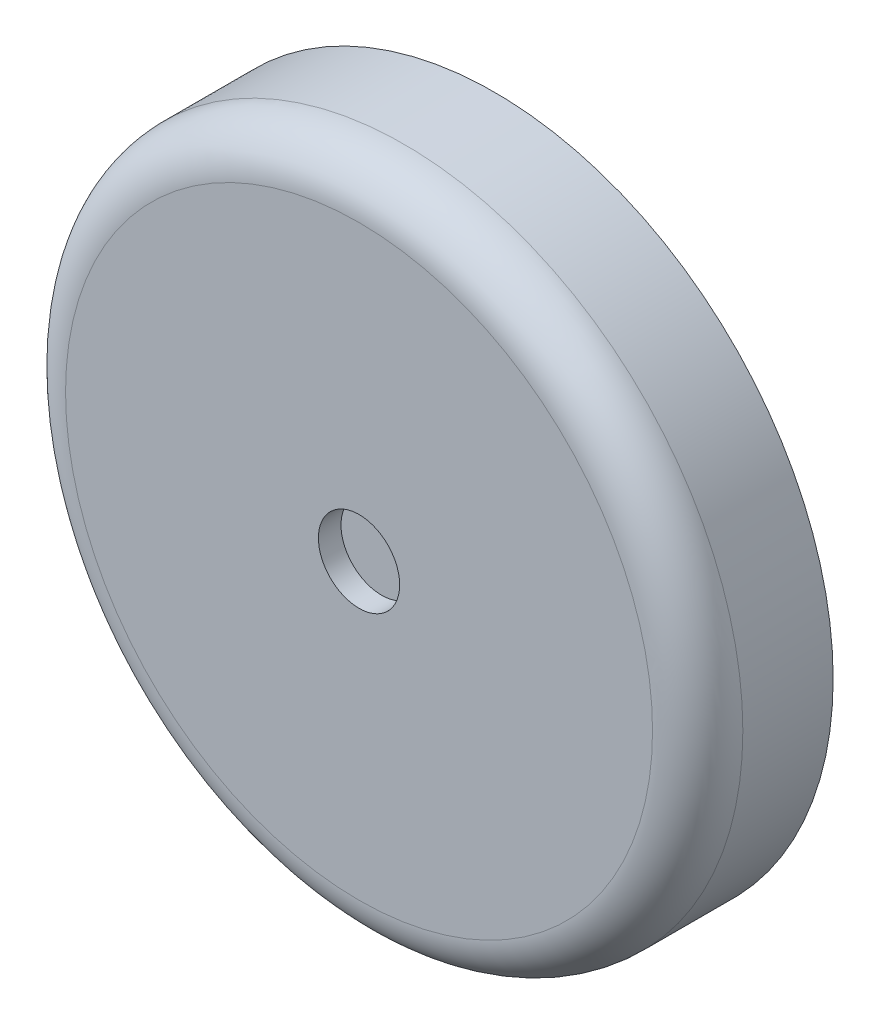
ISO-10303-21;
HEADER;
FILE_DESCRIPTION(('STEP AP214'),'2;1');
FILE_NAME('part.step','',(''),(''),'','','');
FILE_SCHEMA(('AUTOMOTIVE_DESIGN { 1 0 10303 214 1 1 1 1 }'));
ENDSEC;
DATA;
#1=APPLICATION_CONTEXT('core data for automotive mechanical design processes');
#2=APPLICATION_PROTOCOL_DEFINITION('international standard','automotive_design',2000,#1);
#3=PRODUCT_CONTEXT('',#1,'mechanical');
#4=PRODUCT('Part','Part','',(#3));
#5=PRODUCT_RELATED_PRODUCT_CATEGORY('part','',(#4));
#6=PRODUCT_DEFINITION_FORMATION('','',#4);
#7=PRODUCT_DEFINITION_CONTEXT('part definition',#1,'design');
#8=PRODUCT_DEFINITION('design','',#6,#7);
#9=PRODUCT_DEFINITION_SHAPE('','',#8);
#10=(LENGTH_UNIT() NAMED_UNIT(*) SI_UNIT(.MILLI.,.METRE.));
#11=(NAMED_UNIT(*) PLANE_ANGLE_UNIT() SI_UNIT($,.RADIAN.));
#12=(NAMED_UNIT(*) SI_UNIT($,.STERADIAN.) SOLID_ANGLE_UNIT());
#13=UNCERTAINTY_MEASURE_WITH_UNIT(LENGTH_MEASURE(1.E-05),#10,'distance_accuracy_value','');
#14=(GEOMETRIC_REPRESENTATION_CONTEXT(3) GLOBAL_UNCERTAINTY_ASSIGNED_CONTEXT((#13)) GLOBAL_UNIT_ASSIGNED_CONTEXT((#10,
#11,#12)) REPRESENTATION_CONTEXT('',''));
#15=CARTESIAN_POINT('',(0.,0.,0.));
#16=DIRECTION('',(0.,0.,1.));
#17=DIRECTION('',(1.,0.,0.));
#18=AXIS2_PLACEMENT_3D('',#15,#16,#17);
#19=CARTESIAN_POINT('',(0.,0.,6.));
#20=DIRECTION('',(0.,0.,-1.));
#21=DIRECTION('',(-1.,0.,0.));
#22=AXIS2_PLACEMENT_3D('',#19,#20,#21);
#23=CYLINDRICAL_SURFACE('',#22,15.);
#24=CARTESIAN_POINT('',(0.,0.,4.));
#25=DIRECTION('',(0.,0.,1.));
#26=DIRECTION('',(1.,0.,0.));
#27=AXIS2_PLACEMENT_3D('',#24,#25,#26);
#28=CIRCLE('',#27,15.);
#29=CARTESIAN_POINT('',(15.,0.,4.));
#30=VERTEX_POINT('',#29);
#31=EDGE_CURVE('E48',#30,#30,#28,.F.);
#32=ORIENTED_EDGE('',*,*,#31,.T.);
#33=EDGE_LOOP('',(#32));
#34=FACE_BOUND('',#33,.T.);
#35=CARTESIAN_POINT('',(0.,0.,0.));
#36=DIRECTION('',(0.,0.,1.));
#37=DIRECTION('',(1.,0.,0.));
#38=AXIS2_PLACEMENT_3D('',#35,#36,#37);
#39=CIRCLE('',#38,15.);
#40=CARTESIAN_POINT('',(15.,0.,0.));
#41=VERTEX_POINT('',#40);
#42=EDGE_CURVE('E60',#41,#41,#39,.T.);
#43=ORIENTED_EDGE('',*,*,#42,.T.);
#44=EDGE_LOOP('',(#43));
#45=FACE_BOUND('',#44,.T.);
#46=ADVANCED_FACE('F40',(#34,#45),#23,.T.);
#47=CARTESIAN_POINT('',(0.,0.,6.));
#48=DIRECTION('',(0.,0.,1.));
#49=DIRECTION('',(1.,0.,0.));
#50=AXIS2_PLACEMENT_3D('',#47,#48,#49);
#51=PLANE('',#50);
#52=CARTESIAN_POINT('',(0.,0.,6.));
#53=DIRECTION('',(0.,0.,1.));
#54=DIRECTION('',(1.,0.,0.));
#55=AXIS2_PLACEMENT_3D('',#52,#53,#54);
#56=CIRCLE('',#55,1.8);
#57=CARTESIAN_POINT('',(1.8,0.,6.));
#58=VERTEX_POINT('',#57);
#59=EDGE_CURVE('E63',#58,#58,#56,.T.);
#60=ORIENTED_EDGE('',*,*,#59,.F.);
#61=EDGE_LOOP('',(#60));
#62=FACE_BOUND('',#61,.T.);
#63=CARTESIAN_POINT('',(0.,0.,6.));
#64=DIRECTION('',(0.,0.,1.));
#65=DIRECTION('',(1.,0.,0.));
#66=AXIS2_PLACEMENT_3D('',#63,#64,#65);
#67=CIRCLE('',#66,13.);
#68=CARTESIAN_POINT('',(13.,0.,6.));
#69=VERTEX_POINT('',#68);
#70=EDGE_CURVE('E55',#69,#69,#67,.T.);
#71=ORIENTED_EDGE('',*,*,#70,.T.);
#72=EDGE_LOOP('',(#71));
#73=FACE_BOUND('',#72,.T.);
#74=ADVANCED_FACE('F76',(#62,#73),#51,.T.);
#75=CARTESIAN_POINT('',(0.,0.,0.));
#76=DIRECTION('',(0.,0.,1.));
#77=DIRECTION('',(1.,0.,0.));
#78=AXIS2_PLACEMENT_3D('',#75,#76,#77);
#79=PLANE('',#78);
#80=CARTESIAN_POINT('',(0.,0.,0.));
#81=DIRECTION('',(0.,0.,-1.));
#82=DIRECTION('',(-1.,0.,0.));
#83=AXIS2_PLACEMENT_3D('',#80,#81,#82);
#84=CIRCLE('',#83,13.5);
#85=CARTESIAN_POINT('',(-13.5,0.,0.));
#86=VERTEX_POINT('',#85);
#87=EDGE_CURVE('E58',#86,#86,#84,.T.);
#88=ORIENTED_EDGE('',*,*,#87,.F.);
#89=EDGE_LOOP('',(#88));
#90=FACE_BOUND('',#89,.T.);
#91=ORIENTED_EDGE('',*,*,#42,.F.);
#92=EDGE_LOOP('',(#91));
#93=FACE_BOUND('',#92,.T.);
#94=ADVANCED_FACE('F84',(#90,#93),#79,.F.);
#95=CARTESIAN_POINT('',(0.,0.,4.));
#96=DIRECTION('',(0.,0.,1.));
#97=DIRECTION('',(1.,0.,0.));
#98=AXIS2_PLACEMENT_3D('',#95,#96,#97);
#99=TOROIDAL_SURFACE('',#98,13.,2.);
#100=ORIENTED_EDGE('',*,*,#31,.F.);
#101=EDGE_LOOP('',(#100));
#102=FACE_BOUND('',#101,.T.);
#103=ORIENTED_EDGE('',*,*,#70,.F.);
#104=EDGE_LOOP('',(#103));
#105=FACE_BOUND('',#104,.T.);
#106=ADVANCED_FACE('F82',(#102,#105),#99,.T.);
#107=CARTESIAN_POINT('',(0.,0.,4.));
#108=DIRECTION('',(0.,0.,-1.));
#109=DIRECTION('',(-1.,0.,0.));
#110=AXIS2_PLACEMENT_3D('',#107,#108,#109);
#111=CYLINDRICAL_SURFACE('',#110,13.5);
#112=CARTESIAN_POINT('',(0.,0.,2.));
#113=DIRECTION('',(0.,0.,-1.));
#114=DIRECTION('',(-1.,0.,0.));
#115=AXIS2_PLACEMENT_3D('',#112,#113,#114);
#116=CIRCLE('',#115,13.5);
#117=CARTESIAN_POINT('',(-13.5,0.,2.));
#118=VERTEX_POINT('',#117);
#119=EDGE_CURVE('E10',#118,#118,#116,.F.);
#120=ORIENTED_EDGE('',*,*,#119,.T.);
#121=EDGE_LOOP('',(#120));
#122=FACE_BOUND('',#121,.T.);
#123=ORIENTED_EDGE('',*,*,#87,.T.);
#124=EDGE_LOOP('',(#123));
#125=FACE_BOUND('',#124,.T.);
#126=ADVANCED_FACE('F90',(#122,#125),#111,.F.);
#127=CARTESIAN_POINT('',(0.,0.,4.));
#128=DIRECTION('',(0.,0.,-1.));
#129=DIRECTION('',(-1.,0.,0.));
#130=AXIS2_PLACEMENT_3D('',#127,#128,#129);
#131=PLANE('',#130);
#132=CARTESIAN_POINT('',(0.,0.,4.));
#133=DIRECTION('',(0.,0.,-1.));
#134=DIRECTION('',(-1.,0.,0.));
#135=AXIS2_PLACEMENT_3D('',#132,#133,#134);
#136=CIRCLE('',#135,11.5);
#137=CARTESIAN_POINT('',(-11.5,0.,4.));
#138=VERTEX_POINT('',#137);
#139=EDGE_CURVE('E42',#138,#138,#136,.T.);
#140=ORIENTED_EDGE('',*,*,#139,.T.);
#141=EDGE_LOOP('',(#140));
#142=FACE_BOUND('',#141,.T.);
#143=ADVANCED_FACE('F95',(#142),#131,.T.);
#144=CARTESIAN_POINT('',(0.,0.,2.));
#145=DIRECTION('',(0.,0.,-1.));
#146=DIRECTION('',(-1.,0.,0.));
#147=AXIS2_PLACEMENT_3D('',#144,#145,#146);
#148=TOROIDAL_SURFACE('',#147,11.5,2.);
#149=ORIENTED_EDGE('',*,*,#119,.F.);
#150=EDGE_LOOP('',(#149));
#151=FACE_BOUND('',#150,.T.);
#152=ORIENTED_EDGE('',*,*,#139,.F.);
#153=EDGE_LOOP('',(#152));
#154=FACE_BOUND('',#153,.T.);
#155=ADVANCED_FACE('F39',(#151,#154),#148,.F.);
#156=CARTESIAN_POINT('',(0.,0.,5.));
#157=DIRECTION('',(0.,0.,1.));
#158=DIRECTION('',(1.,0.,0.));
#159=AXIS2_PLACEMENT_3D('',#156,#157,#158);
#160=CYLINDRICAL_SURFACE('',#159,1.8);
#161=CARTESIAN_POINT('',(0.,0.,5.));
#162=DIRECTION('',(0.,0.,1.));
#163=DIRECTION('',(1.,0.,0.));
#164=AXIS2_PLACEMENT_3D('',#161,#162,#163);
#165=CIRCLE('',#164,1.8);
#166=CARTESIAN_POINT('',(1.8,0.,5.));
#167=VERTEX_POINT('',#166);
#168=EDGE_CURVE('E65',#167,#167,#165,.T.);
#169=ORIENTED_EDGE('',*,*,#168,.F.);
#170=EDGE_LOOP('',(#169));
#171=FACE_BOUND('',#170,.T.);
#172=ORIENTED_EDGE('',*,*,#59,.T.);
#173=EDGE_LOOP('',(#172));
#174=FACE_BOUND('',#173,.T.);
#175=ADVANCED_FACE('F74',(#171,#174),#160,.F.);
#176=CARTESIAN_POINT('',(0.,0.,5.));
#177=DIRECTION('',(0.,0.,1.));
#178=DIRECTION('',(1.,0.,0.));
#179=AXIS2_PLACEMENT_3D('',#176,#177,#178);
#180=PLANE('',#179);
#181=ORIENTED_EDGE('',*,*,#168,.T.);
#182=EDGE_LOOP('',(#181));
#183=FACE_BOUND('',#182,.T.);
#184=ADVANCED_FACE('F66',(#183),#180,.T.);
#185=CLOSED_SHELL('',(#46,#74,#94,#106,#126,#143,#155,#175,#184));
#186=MANIFOLD_SOLID_BREP('B2',#185);
#187=ADVANCED_BREP_SHAPE_REPRESENTATION('',(#18,#186),#14);
#188=SHAPE_DEFINITION_REPRESENTATION(#9,#187);
ENDSEC;
END-ISO-10303-21;
